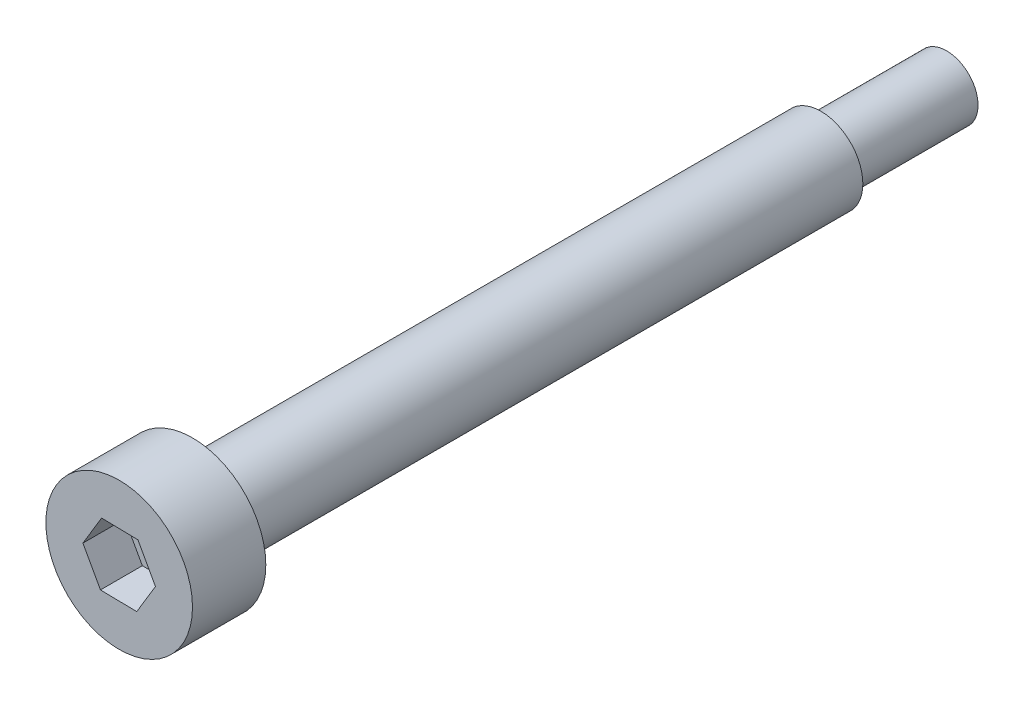
ISO-10303-21;
HEADER;
FILE_DESCRIPTION(('STEP AP214'),'2;1');
FILE_NAME('part.step','',(''),(''),'','','');
FILE_SCHEMA(('AUTOMOTIVE_DESIGN { 1 0 10303 214 1 1 1 1 }'));
ENDSEC;
DATA;
#1=APPLICATION_CONTEXT('core data for automotive mechanical design processes');
#2=APPLICATION_PROTOCOL_DEFINITION('international standard','automotive_design',2000,#1);
#3=PRODUCT_CONTEXT('',#1,'mechanical');
#4=PRODUCT('Part','Part','',(#3));
#5=PRODUCT_RELATED_PRODUCT_CATEGORY('part','',(#4));
#6=PRODUCT_DEFINITION_FORMATION('','',#4);
#7=PRODUCT_DEFINITION_CONTEXT('part definition',#1,'design');
#8=PRODUCT_DEFINITION('design','',#6,#7);
#9=PRODUCT_DEFINITION_SHAPE('','',#8);
#10=(LENGTH_UNIT() NAMED_UNIT(*) SI_UNIT(.MILLI.,.METRE.));
#11=(NAMED_UNIT(*) PLANE_ANGLE_UNIT() SI_UNIT($,.RADIAN.));
#12=(NAMED_UNIT(*) SI_UNIT($,.STERADIAN.) SOLID_ANGLE_UNIT());
#13=UNCERTAINTY_MEASURE_WITH_UNIT(LENGTH_MEASURE(1.E-05),#10,'distance_accuracy_value','');
#14=(GEOMETRIC_REPRESENTATION_CONTEXT(3) GLOBAL_UNCERTAINTY_ASSIGNED_CONTEXT((#13)) GLOBAL_UNIT_ASSIGNED_CONTEXT((#10,
#11,#12)) REPRESENTATION_CONTEXT('',''));
#15=CARTESIAN_POINT('',(0.,0.,0.));
#16=DIRECTION('',(0.,0.,1.));
#17=DIRECTION('',(1.,0.,0.));
#18=AXIS2_PLACEMENT_3D('',#15,#16,#17);
#19=CARTESIAN_POINT('',(0.,0.,3.5));
#20=DIRECTION('',(0.,0.,-1.));
#21=DIRECTION('',(-1.,0.,0.));
#22=AXIS2_PLACEMENT_3D('',#19,#20,#21);
#23=CYLINDRICAL_SURFACE('',#22,3.5);
#24=CARTESIAN_POINT('',(0.,0.,3.5));
#25=DIRECTION('',(0.,0.,1.));
#26=DIRECTION('',(1.,0.,0.));
#27=AXIS2_PLACEMENT_3D('',#24,#25,#26);
#28=CIRCLE('',#27,3.5);
#29=CARTESIAN_POINT('',(3.5,0.,3.5));
#30=VERTEX_POINT('',#29);
#31=EDGE_CURVE('E43',#30,#30,#28,.T.);
#32=ORIENTED_EDGE('',*,*,#31,.F.);
#33=EDGE_LOOP('',(#32));
#34=FACE_BOUND('',#33,.T.);
#35=CARTESIAN_POINT('',(0.,0.,0.));
#36=DIRECTION('',(0.,0.,1.));
#37=DIRECTION('',(1.,0.,0.));
#38=AXIS2_PLACEMENT_3D('',#35,#36,#37);
#39=CIRCLE('',#38,3.5);
#40=CARTESIAN_POINT('',(3.5,0.,0.));
#41=VERTEX_POINT('',#40);
#42=EDGE_CURVE('E138',#41,#41,#39,.T.);
#43=ORIENTED_EDGE('',*,*,#42,.T.);
#44=EDGE_LOOP('',(#43));
#45=FACE_BOUND('',#44,.T.);
#46=ADVANCED_FACE('F36',(#34,#45),#23,.T.);
#47=CARTESIAN_POINT('',(0.,0.,3.5));
#48=DIRECTION('',(0.,0.,1.));
#49=DIRECTION('',(1.,0.,0.));
#50=AXIS2_PLACEMENT_3D('',#47,#48,#49);
#51=PLANE('',#50);
#52=DIRECTION('',(-0.483885708586405,0.875131202178183,0.));
#53=VECTOR('',#52,1.);
#54=CARTESIAN_POINT('',(1.73175411943134,-0.0320572898511147,3.5));
#55=LINE('',#54,#53);
#56=CARTESIAN_POINT('',(1.73175411943134,-0.0320572898511147,3.5));
#57=VERTEX_POINT('',#56);
#58=CARTESIAN_POINT('',(0.893639487103215,1.48371441561033,3.5));
#59=VERTEX_POINT('',#58);
#60=EDGE_CURVE('E50',#57,#59,#55,.T.);
#61=ORIENTED_EDGE('',*,*,#60,.F.);
#62=DIRECTION('',(0.51594299843752,0.856622917253152,0.));
#63=VECTOR('',#62,1.);
#64=CARTESIAN_POINT('',(0.838114632328121,-1.51577170546145,3.5));
#65=LINE('',#64,#63);
#66=CARTESIAN_POINT('',(0.838114632328121,-1.51577170546145,3.5));
#67=VERTEX_POINT('',#66);
#68=EDGE_CURVE('E134',#67,#57,#65,.T.);
#69=ORIENTED_EDGE('',*,*,#68,.F.);
#70=DIRECTION('',(0.999828707023925,-0.0185082849250311,0.));
#71=VECTOR('',#70,1.);
#72=CARTESIAN_POINT('',(-0.893639487103214,-1.48371441561033,3.5));
#73=LINE('',#72,#71);
#74=CARTESIAN_POINT('',(-0.893639487103214,-1.48371441561033,3.5));
#75=VERTEX_POINT('',#74);
#76=EDGE_CURVE('E132',#75,#67,#73,.T.);
#77=ORIENTED_EDGE('',*,*,#76,.F.);
#78=DIRECTION('',(0.483885708586405,-0.875131202178183,0.));
#79=VECTOR('',#78,1.);
#80=CARTESIAN_POINT('',(-1.73175411943134,0.0320572898511147,3.5));
#81=LINE('',#80,#79);
#82=CARTESIAN_POINT('',(-1.73175411943134,0.0320572898511147,3.5));
#83=VERTEX_POINT('',#82);
#84=EDGE_CURVE('E98',#83,#75,#81,.T.);
#85=ORIENTED_EDGE('',*,*,#84,.F.);
#86=DIRECTION('',(-0.51594299843752,-0.856622917253152,0.));
#87=VECTOR('',#86,1.);
#88=CARTESIAN_POINT('',(-0.838114632328121,1.51577170546145,3.5));
#89=LINE('',#88,#87);
#90=CARTESIAN_POINT('',(-0.838114632328121,1.51577170546145,3.5));
#91=VERTEX_POINT('',#90);
#92=EDGE_CURVE('E128',#91,#83,#89,.T.);
#93=ORIENTED_EDGE('',*,*,#92,.F.);
#94=DIRECTION('',(-0.999828707023925,0.0185082849250311,0.));
#95=VECTOR('',#94,1.);
#96=CARTESIAN_POINT('',(0.893639487103215,1.48371441561033,3.5));
#97=LINE('',#96,#95);
#98=EDGE_CURVE('E124',#59,#91,#97,.T.);
#99=ORIENTED_EDGE('',*,*,#98,.F.);
#100=EDGE_LOOP('',(#61,#69,#77,#85,#93,#99));
#101=FACE_BOUND('',#100,.T.);
#102=ORIENTED_EDGE('',*,*,#31,.T.);
#103=EDGE_LOOP('',(#102));
#104=FACE_BOUND('',#103,.T.);
#105=ADVANCED_FACE('F152',(#101,#104),#51,.T.);
#106=CARTESIAN_POINT('',(0.,0.,0.));
#107=DIRECTION('',(0.,0.,1.));
#108=DIRECTION('',(1.,0.,0.));
#109=AXIS2_PLACEMENT_3D('',#106,#107,#108);
#110=PLANE('',#109);
#111=CARTESIAN_POINT('',(0.,0.,0.));
#112=DIRECTION('',(0.,0.,1.));
#113=DIRECTION('',(1.,0.,0.));
#114=AXIS2_PLACEMENT_3D('',#111,#112,#113);
#115=CIRCLE('',#114,2.);
#116=CARTESIAN_POINT('',(2.,0.,0.));
#117=VERTEX_POINT('',#116);
#118=EDGE_CURVE('E11',#117,#117,#115,.F.);
#119=ORIENTED_EDGE('',*,*,#118,.F.);
#120=EDGE_LOOP('',(#119));
#121=FACE_BOUND('',#120,.T.);
#122=ORIENTED_EDGE('',*,*,#42,.F.);
#123=EDGE_LOOP('',(#122));
#124=FACE_BOUND('',#123,.T.);
#125=ADVANCED_FACE('F149',(#121,#124),#110,.F.);
#126=CARTESIAN_POINT('',(1.73175411943134,-0.0320572898511147,1.5));
#127=DIRECTION('',(0.875131202178183,0.483885708586405,0.));
#128=DIRECTION('',(-0.483885708586405,0.875131202178183,0.));
#129=AXIS2_PLACEMENT_3D('',#126,#127,#128);
#130=PLANE('',#129);
#131=ORIENTED_EDGE('',*,*,#60,.T.);
#132=DIRECTION('',(0.,0.,1.));
#133=VECTOR('',#132,1.);
#134=CARTESIAN_POINT('',(0.893639487103215,1.48371441561033,1.5));
#135=LINE('',#134,#133);
#136=CARTESIAN_POINT('',(0.893639487103215,1.48371441561033,1.5));
#137=VERTEX_POINT('',#136);
#138=EDGE_CURVE('E80',#137,#59,#135,.T.);
#139=ORIENTED_EDGE('',*,*,#138,.F.);
#140=DIRECTION('',(-0.483885708586405,0.875131202178183,0.));
#141=VECTOR('',#140,1.);
#142=CARTESIAN_POINT('',(1.73175411943134,-0.0320572898511147,1.5));
#143=LINE('',#142,#141);
#144=CARTESIAN_POINT('',(1.73175411943134,-0.0320572898511147,1.5));
#145=VERTEX_POINT('',#144);
#146=EDGE_CURVE('E136',#145,#137,#143,.T.);
#147=ORIENTED_EDGE('',*,*,#146,.F.);
#148=DIRECTION('',(0.,0.,1.));
#149=VECTOR('',#148,1.);
#150=CARTESIAN_POINT('',(1.73175411943134,-0.0320572898511147,1.5));
#151=LINE('',#150,#149);
#152=EDGE_CURVE('E58',#145,#57,#151,.T.);
#153=ORIENTED_EDGE('',*,*,#152,.T.);
#154=EDGE_LOOP('',(#131,#139,#147,#153));
#155=FACE_BOUND('',#154,.T.);
#156=ADVANCED_FACE('F151',(#155),#130,.F.);
#157=CARTESIAN_POINT('',(0.838114632328121,-1.51577170546145,1.5));
#158=DIRECTION('',(0.856622917253152,-0.51594299843752,0.));
#159=DIRECTION('',(0.51594299843752,0.856622917253153,0.));
#160=AXIS2_PLACEMENT_3D('',#157,#158,#159);
#161=PLANE('',#160);
#162=ORIENTED_EDGE('',*,*,#68,.T.);
#163=ORIENTED_EDGE('',*,*,#152,.F.);
#164=DIRECTION('',(0.51594299843752,0.856622917253152,0.));
#165=VECTOR('',#164,1.);
#166=CARTESIAN_POINT('',(0.838114632328121,-1.51577170546145,1.5));
#167=LINE('',#166,#165);
#168=CARTESIAN_POINT('',(0.838114632328121,-1.51577170546145,1.5));
#169=VERTEX_POINT('',#168);
#170=EDGE_CURVE('E110',#169,#145,#167,.T.);
#171=ORIENTED_EDGE('',*,*,#170,.F.);
#172=DIRECTION('',(0.,0.,1.));
#173=VECTOR('',#172,1.);
#174=CARTESIAN_POINT('',(0.838114632328121,-1.51577170546145,1.5));
#175=LINE('',#174,#173);
#176=EDGE_CURVE('E102',#169,#67,#175,.T.);
#177=ORIENTED_EDGE('',*,*,#176,.T.);
#178=EDGE_LOOP('',(#162,#163,#171,#177));
#179=FACE_BOUND('',#178,.T.);
#180=ADVANCED_FACE('F158',(#179),#161,.F.);
#181=CARTESIAN_POINT('',(-0.893639487103214,-1.48371441561033,1.5));
#182=DIRECTION('',(-0.0185082849250311,-0.999828707023925,0.));
#183=DIRECTION('',(0.999828707023925,-0.0185082849250311,0.));
#184=AXIS2_PLACEMENT_3D('',#181,#182,#183);
#185=PLANE('',#184);
#186=ORIENTED_EDGE('',*,*,#76,.T.);
#187=ORIENTED_EDGE('',*,*,#176,.F.);
#188=DIRECTION('',(0.999828707023925,-0.0185082849250311,0.));
#189=VECTOR('',#188,1.);
#190=CARTESIAN_POINT('',(-0.893639487103214,-1.48371441561033,1.5));
#191=LINE('',#190,#189);
#192=CARTESIAN_POINT('',(-0.893639487103214,-1.48371441561033,1.5));
#193=VERTEX_POINT('',#192);
#194=EDGE_CURVE('E106',#193,#169,#191,.T.);
#195=ORIENTED_EDGE('',*,*,#194,.F.);
#196=DIRECTION('',(0.,0.,1.));
#197=VECTOR('',#196,1.);
#198=CARTESIAN_POINT('',(-0.893639487103214,-1.48371441561033,1.5));
#199=LINE('',#198,#197);
#200=EDGE_CURVE('E91',#193,#75,#199,.T.);
#201=ORIENTED_EDGE('',*,*,#200,.T.);
#202=EDGE_LOOP('',(#186,#187,#195,#201));
#203=FACE_BOUND('',#202,.T.);
#204=ADVANCED_FACE('F107',(#203),#185,.F.);
#205=CARTESIAN_POINT('',(-1.73175411943134,0.0320572898511147,1.5));
#206=DIRECTION('',(-0.875131202178183,-0.483885708586405,0.));
#207=DIRECTION('',(0.483885708586405,-0.875131202178183,0.));
#208=AXIS2_PLACEMENT_3D('',#205,#206,#207);
#209=PLANE('',#208);
#210=ORIENTED_EDGE('',*,*,#84,.T.);
#211=ORIENTED_EDGE('',*,*,#200,.F.);
#212=DIRECTION('',(0.483885708586405,-0.875131202178183,0.));
#213=VECTOR('',#212,1.);
#214=CARTESIAN_POINT('',(-1.73175411943134,0.0320572898511147,1.5));
#215=LINE('',#214,#213);
#216=CARTESIAN_POINT('',(-1.73175411943134,0.0320572898511147,1.5));
#217=VERTEX_POINT('',#216);
#218=EDGE_CURVE('E95',#217,#193,#215,.T.);
#219=ORIENTED_EDGE('',*,*,#218,.F.);
#220=DIRECTION('',(0.,0.,1.));
#221=VECTOR('',#220,1.);
#222=CARTESIAN_POINT('',(-1.73175411943134,0.0320572898511147,1.5));
#223=LINE('',#222,#221);
#224=EDGE_CURVE('E103',#217,#83,#223,.T.);
#225=ORIENTED_EDGE('',*,*,#224,.T.);
#226=EDGE_LOOP('',(#210,#211,#219,#225));
#227=FACE_BOUND('',#226,.T.);
#228=ADVANCED_FACE('F93',(#227),#209,.F.);
#229=CARTESIAN_POINT('',(-0.838114632328121,1.51577170546145,1.5));
#230=DIRECTION('',(-0.856622917253152,0.51594299843752,0.));
#231=DIRECTION('',(-0.51594299843752,-0.856622917253153,0.));
#232=AXIS2_PLACEMENT_3D('',#229,#230,#231);
#233=PLANE('',#232);
#234=ORIENTED_EDGE('',*,*,#92,.T.);
#235=ORIENTED_EDGE('',*,*,#224,.F.);
#236=DIRECTION('',(-0.51594299843752,-0.856622917253152,0.));
#237=VECTOR('',#236,1.);
#238=CARTESIAN_POINT('',(-0.838114632328121,1.51577170546145,1.5));
#239=LINE('',#238,#237);
#240=CARTESIAN_POINT('',(-0.838114632328121,1.51577170546145,1.5));
#241=VERTEX_POINT('',#240);
#242=EDGE_CURVE('E116',#241,#217,#239,.T.);
#243=ORIENTED_EDGE('',*,*,#242,.F.);
#244=DIRECTION('',(0.,0.,1.));
#245=VECTOR('',#244,1.);
#246=CARTESIAN_POINT('',(-0.838114632328121,1.51577170546145,1.5));
#247=LINE('',#246,#245);
#248=EDGE_CURVE('E141',#241,#91,#247,.T.);
#249=ORIENTED_EDGE('',*,*,#248,.T.);
#250=EDGE_LOOP('',(#234,#235,#243,#249));
#251=FACE_BOUND('',#250,.T.);
#252=ADVANCED_FACE('F205',(#251),#233,.F.);
#253=CARTESIAN_POINT('',(0.893639487103215,1.48371441561033,1.5));
#254=DIRECTION('',(0.0185082849250311,0.999828707023925,0.));
#255=DIRECTION('',(-0.999828707023925,0.0185082849250311,0.));
#256=AXIS2_PLACEMENT_3D('',#253,#254,#255);
#257=PLANE('',#256);
#258=ORIENTED_EDGE('',*,*,#98,.T.);
#259=ORIENTED_EDGE('',*,*,#248,.F.);
#260=DIRECTION('',(-0.999828707023925,0.0185082849250311,0.));
#261=VECTOR('',#260,1.);
#262=CARTESIAN_POINT('',(0.893639487103215,1.48371441561033,1.5));
#263=LINE('',#262,#261);
#264=EDGE_CURVE('E118',#137,#241,#263,.T.);
#265=ORIENTED_EDGE('',*,*,#264,.F.);
#266=ORIENTED_EDGE('',*,*,#138,.T.);
#267=EDGE_LOOP('',(#258,#259,#265,#266));
#268=FACE_BOUND('',#267,.T.);
#269=ADVANCED_FACE('F214',(#268),#257,.F.);
#270=CARTESIAN_POINT('',(0.,0.,1.5));
#271=DIRECTION('',(0.,0.,1.));
#272=DIRECTION('',(1.,0.,0.));
#273=AXIS2_PLACEMENT_3D('',#270,#271,#272);
#274=PLANE('',#273);
#275=ORIENTED_EDGE('',*,*,#146,.T.);
#276=ORIENTED_EDGE('',*,*,#264,.T.);
#277=ORIENTED_EDGE('',*,*,#242,.T.);
#278=ORIENTED_EDGE('',*,*,#218,.T.);
#279=ORIENTED_EDGE('',*,*,#194,.T.);
#280=ORIENTED_EDGE('',*,*,#170,.T.);
#281=EDGE_LOOP('',(#275,#276,#277,#278,#279,#280));
#282=FACE_BOUND('',#281,.T.);
#283=ADVANCED_FACE('F113',(#282),#274,.T.);
#284=CARTESIAN_POINT('',(0.,0.,-30.));
#285=DIRECTION('',(0.,0.,1.));
#286=DIRECTION('',(1.,0.,0.));
#287=AXIS2_PLACEMENT_3D('',#284,#285,#286);
#288=CYLINDRICAL_SURFACE('',#287,2.);
#289=CARTESIAN_POINT('',(0.,0.,-30.));
#290=DIRECTION('',(0.,0.,-1.));
#291=DIRECTION('',(-1.,0.,0.));
#292=AXIS2_PLACEMENT_3D('',#289,#290,#291);
#293=CIRCLE('',#292,2.);
#294=CARTESIAN_POINT('',(-2.,0.,-30.));
#295=VERTEX_POINT('',#294);
#296=EDGE_CURVE('E125',#295,#295,#293,.T.);
#297=ORIENTED_EDGE('',*,*,#296,.F.);
#298=EDGE_LOOP('',(#297));
#299=FACE_BOUND('',#298,.T.);
#300=ORIENTED_EDGE('',*,*,#118,.T.);
#301=EDGE_LOOP('',(#300));
#302=FACE_BOUND('',#301,.T.);
#303=ADVANCED_FACE('F232',(#299,#302),#288,.T.);
#304=CARTESIAN_POINT('',(0.,0.,-30.));
#305=DIRECTION('',(0.,0.,-1.));
#306=DIRECTION('',(-1.,0.,0.));
#307=AXIS2_PLACEMENT_3D('',#304,#305,#306);
#308=PLANE('',#307);
#309=CARTESIAN_POINT('',(0.,0.,-30.));
#310=DIRECTION('',(0.,0.,-1.));
#311=DIRECTION('',(-1.,0.,0.));
#312=AXIS2_PLACEMENT_3D('',#309,#310,#311);
#313=CIRCLE('',#312,1.5);
#314=CARTESIAN_POINT('',(-1.5,0.,-30.));
#315=VERTEX_POINT('',#314);
#316=EDGE_CURVE('E284',#315,#315,#313,.T.);
#317=ORIENTED_EDGE('',*,*,#316,.F.);
#318=EDGE_LOOP('',(#317));
#319=FACE_BOUND('',#318,.T.);
#320=ORIENTED_EDGE('',*,*,#296,.T.);
#321=EDGE_LOOP('',(#320));
#322=FACE_BOUND('',#321,.T.);
#323=ADVANCED_FACE('F245',(#319,#322),#308,.T.);
#324=CARTESIAN_POINT('',(0.,0.,-36.));
#325=DIRECTION('',(0.,0.,1.));
#326=DIRECTION('',(1.,0.,0.));
#327=AXIS2_PLACEMENT_3D('',#324,#325,#326);
#328=CYLINDRICAL_SURFACE('',#327,1.5);
#329=CARTESIAN_POINT('',(0.,0.,-36.));
#330=DIRECTION('',(0.,0.,-1.));
#331=DIRECTION('',(-1.,0.,0.));
#332=AXIS2_PLACEMENT_3D('',#329,#330,#331);
#333=CIRCLE('',#332,1.5);
#334=CARTESIAN_POINT('',(-1.5,0.,-36.));
#335=VERTEX_POINT('',#334);
#336=EDGE_CURVE('E283',#335,#335,#333,.T.);
#337=ORIENTED_EDGE('',*,*,#336,.F.);
#338=EDGE_LOOP('',(#337));
#339=FACE_BOUND('',#338,.T.);
#340=ORIENTED_EDGE('',*,*,#316,.T.);
#341=EDGE_LOOP('',(#340));
#342=FACE_BOUND('',#341,.T.);
#343=ADVANCED_FACE('F255',(#339,#342),#328,.T.);
#344=CARTESIAN_POINT('',(0.,0.,-36.));
#345=DIRECTION('',(0.,0.,-1.));
#346=DIRECTION('',(-1.,0.,0.));
#347=AXIS2_PLACEMENT_3D('',#344,#345,#346);
#348=PLANE('',#347);
#349=ORIENTED_EDGE('',*,*,#336,.T.);
#350=EDGE_LOOP('',(#349));
#351=FACE_BOUND('',#350,.T.);
#352=ADVANCED_FACE('F266',(#351),#348,.T.);
#353=CLOSED_SHELL('',(#46,#105,#125,#156,#180,#204,#228,#252,#269,#283,#303,#323,#343,#352));
#354=MANIFOLD_SOLID_BREP('B2',#353);
#355=ADVANCED_BREP_SHAPE_REPRESENTATION('',(#18,#354),#14);
#356=SHAPE_DEFINITION_REPRESENTATION(#9,#355);
ENDSEC;
END-ISO-10303-21;
